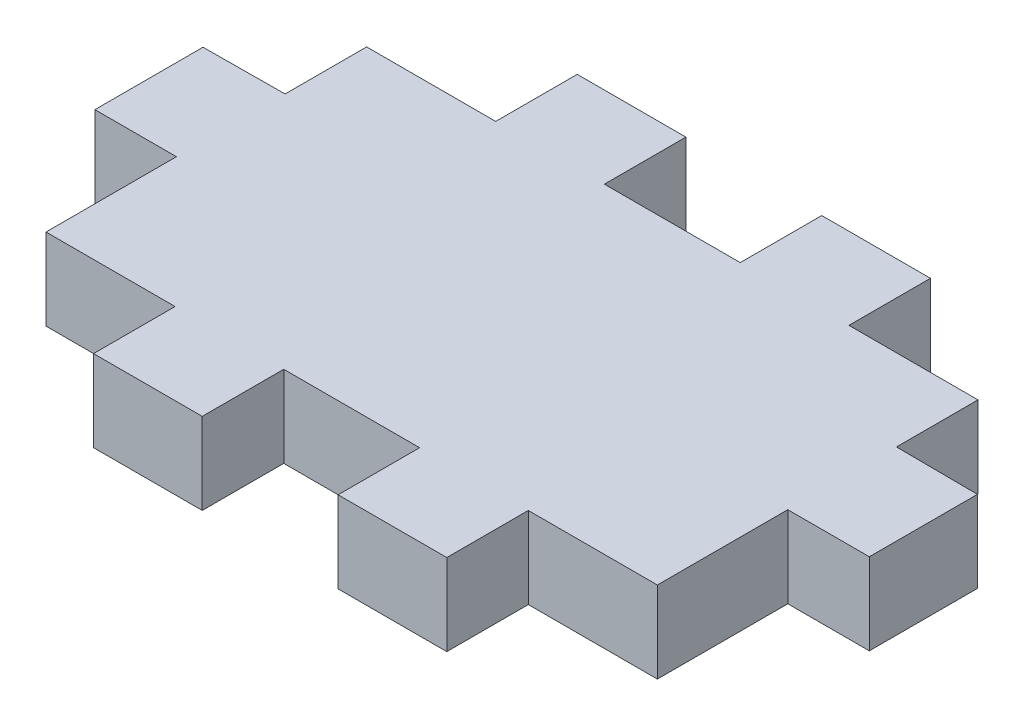
ISO-10303-21;
HEADER;
FILE_DESCRIPTION(('STEP AP214'),'2;1');
FILE_NAME('part.step','',(''),(''),'','','');
FILE_SCHEMA(('AUTOMOTIVE_DESIGN { 1 0 10303 214 1 1 1 1 }'));
ENDSEC;
DATA;
#1=APPLICATION_CONTEXT('core data for automotive mechanical design processes');
#2=APPLICATION_PROTOCOL_DEFINITION('international standard','automotive_design',2000,#1);
#3=PRODUCT_CONTEXT('',#1,'mechanical');
#4=PRODUCT('Part','Part','',(#3));
#5=PRODUCT_RELATED_PRODUCT_CATEGORY('part','',(#4));
#6=PRODUCT_DEFINITION_FORMATION('','',#4);
#7=PRODUCT_DEFINITION_CONTEXT('part definition',#1,'design');
#8=PRODUCT_DEFINITION('design','',#6,#7);
#9=PRODUCT_DEFINITION_SHAPE('','',#8);
#10=(LENGTH_UNIT() NAMED_UNIT(*) SI_UNIT(.MILLI.,.METRE.));
#11=(NAMED_UNIT(*) PLANE_ANGLE_UNIT() SI_UNIT($,.RADIAN.));
#12=(NAMED_UNIT(*) SI_UNIT($,.STERADIAN.) SOLID_ANGLE_UNIT());
#13=UNCERTAINTY_MEASURE_WITH_UNIT(LENGTH_MEASURE(1.E-05),#10,'distance_accuracy_value','');
#14=(GEOMETRIC_REPRESENTATION_CONTEXT(3) GLOBAL_UNCERTAINTY_ASSIGNED_CONTEXT((#13)) GLOBAL_UNIT_ASSIGNED_CONTEXT((#10,
#11,#12)) REPRESENTATION_CONTEXT('',''));
#15=CARTESIAN_POINT('',(0.,0.,0.));
#16=DIRECTION('',(0.,0.,1.));
#17=DIRECTION('',(1.,0.,0.));
#18=AXIS2_PLACEMENT_3D('',#15,#16,#17);
#19=CARTESIAN_POINT('',(-13.5,-7.,-7.2));
#20=DIRECTION('',(0.,0.,-1.));
#21=DIRECTION('',(-1.,0.,0.));
#22=AXIS2_PLACEMENT_3D('',#19,#20,#21);
#23=PLANE('',#22);
#24=DIRECTION('',(-1.,0.,0.));
#25=VECTOR('',#24,1.);
#26=CARTESIAN_POINT('',(-13.5,3.,-7.2));
#27=LINE('',#26,#25);
#28=CARTESIAN_POINT('',(-1.75,3.,-7.2));
#29=VERTEX_POINT('',#28);
#30=CARTESIAN_POINT('',(-5.75,3.,-7.2));
#31=VERTEX_POINT('',#30);
#32=EDGE_CURVE('E343',#29,#31,#27,.T.);
#33=ORIENTED_EDGE('',*,*,#32,.T.);
#34=DIRECTION('',(0.,1.,0.));
#35=VECTOR('',#34,1.);
#36=CARTESIAN_POINT('',(-5.75,-7.,-7.2));
#37=LINE('',#36,#35);
#38=CARTESIAN_POINT('',(-5.75,0.,-7.2));
#39=VERTEX_POINT('',#38);
#40=EDGE_CURVE('E321',#39,#31,#37,.T.);
#41=ORIENTED_EDGE('',*,*,#40,.F.);
#42=DIRECTION('',(1.,0.,0.));
#43=VECTOR('',#42,1.);
#44=CARTESIAN_POINT('',(0.,0.,-7.2));
#45=LINE('',#44,#43);
#46=CARTESIAN_POINT('',(-1.75,0.,-7.2));
#47=VERTEX_POINT('',#46);
#48=EDGE_CURVE('E422',#39,#47,#45,.T.);
#49=ORIENTED_EDGE('',*,*,#48,.T.);
#50=DIRECTION('',(0.,1.,0.));
#51=VECTOR('',#50,1.);
#52=CARTESIAN_POINT('',(-1.75,-7.,-7.2));
#53=LINE('',#52,#51);
#54=EDGE_CURVE('E426',#47,#29,#53,.T.);
#55=ORIENTED_EDGE('',*,*,#54,.T.);
#56=EDGE_LOOP('',(#33,#41,#49,#55));
#57=FACE_BOUND('',#56,.T.);
#58=ADVANCED_FACE('F39',(#57),#23,.F.);
#59=CARTESIAN_POINT('',(15.,3.,-25.));
#60=DIRECTION('',(0.,0.,1.));
#61=DIRECTION('',(1.,0.,0.));
#62=AXIS2_PLACEMENT_3D('',#59,#60,#61);
#63=PLANE('',#62);
#64=DIRECTION('',(-1.,0.,0.));
#65=VECTOR('',#64,1.);
#66=CARTESIAN_POINT('',(15.,3.,-25.));
#67=LINE('',#66,#65);
#68=CARTESIAN_POINT('',(7.24999999999989,3.,-25.));
#69=VERTEX_POINT('',#68);
#70=CARTESIAN_POINT('',(3.2499999999999,3.,-25.));
#71=VERTEX_POINT('',#70);
#72=EDGE_CURVE('E397',#69,#71,#67,.T.);
#73=ORIENTED_EDGE('',*,*,#72,.F.);
#74=DIRECTION('',(0.,1.,0.));
#75=VECTOR('',#74,1.);
#76=CARTESIAN_POINT('',(7.24999999999989,-7.,-25.));
#77=LINE('',#76,#75);
#78=CARTESIAN_POINT('',(7.24999999999989,0.,-25.));
#79=VERTEX_POINT('',#78);
#80=EDGE_CURVE('E361',#79,#69,#77,.T.);
#81=ORIENTED_EDGE('',*,*,#80,.F.);
#82=DIRECTION('',(-1.,0.,0.));
#83=VECTOR('',#82,1.);
#84=CARTESIAN_POINT('',(15.,0.,-25.));
#85=LINE('',#84,#83);
#86=CARTESIAN_POINT('',(3.2499999999999,0.,-25.));
#87=VERTEX_POINT('',#86);
#88=EDGE_CURVE('E394',#79,#87,#85,.T.);
#89=ORIENTED_EDGE('',*,*,#88,.T.);
#90=DIRECTION('',(0.,1.,0.));
#91=VECTOR('',#90,1.);
#92=CARTESIAN_POINT('',(3.2499999999999,-7.,-25.));
#93=LINE('',#92,#91);
#94=EDGE_CURVE('E374',#87,#71,#93,.T.);
#95=ORIENTED_EDGE('',*,*,#94,.T.);
#96=EDGE_LOOP('',(#73,#81,#89,#95));
#97=FACE_BOUND('',#96,.T.);
#98=ADVANCED_FACE('F507',(#97),#63,.F.);
#99=CARTESIAN_POINT('',(-1.75000000000009,3.,-25.));
#100=VERTEX_POINT('',#99);
#101=CARTESIAN_POINT('',(-5.75000000000006,3.,-25.));
#102=VERTEX_POINT('',#101);
#103=EDGE_CURVE('E393',#100,#102,#67,.T.);
#104=ORIENTED_EDGE('',*,*,#103,.F.);
#105=DIRECTION('',(0.,1.,0.));
#106=VECTOR('',#105,1.);
#107=CARTESIAN_POINT('',(-1.75000000000009,-7.,-25.));
#108=LINE('',#107,#106);
#109=CARTESIAN_POINT('',(-1.75000000000009,0.,-25.));
#110=VERTEX_POINT('',#109);
#111=EDGE_CURVE('E378',#110,#100,#108,.T.);
#112=ORIENTED_EDGE('',*,*,#111,.F.);
#113=CARTESIAN_POINT('',(-5.75000000000006,0.,-25.));
#114=VERTEX_POINT('',#113);
#115=EDGE_CURVE('E400',#110,#114,#85,.T.);
#116=ORIENTED_EDGE('',*,*,#115,.T.);
#117=DIRECTION('',(0.,1.,0.));
#118=VECTOR('',#117,1.);
#119=CARTESIAN_POINT('',(-5.75000000000006,-7.,-25.));
#120=LINE('',#119,#118);
#121=EDGE_CURVE('E385',#114,#102,#120,.T.);
#122=ORIENTED_EDGE('',*,*,#121,.T.);
#123=EDGE_LOOP('',(#104,#112,#116,#122));
#124=FACE_BOUND('',#123,.T.);
#125=ADVANCED_FACE('F488',(#124),#63,.F.);
#126=CARTESIAN_POINT('',(15.,3.,-25.));
#127=DIRECTION('',(-1.,0.,0.));
#128=DIRECTION('',(0.,0.,1.));
#129=AXIS2_PLACEMENT_3D('',#126,#127,#128);
#130=PLANE('',#129);
#131=DIRECTION('',(0.,0.,-1.));
#132=VECTOR('',#131,1.);
#133=CARTESIAN_POINT('',(15.,3.,-25.));
#134=LINE('',#133,#132);
#135=CARTESIAN_POINT('',(14.9999999999999,3.,-15.0000000000002));
#136=VERTEX_POINT('',#135);
#137=CARTESIAN_POINT('',(14.9999999999999,3.,-18.9776324514102));
#138=VERTEX_POINT('',#137);
#139=EDGE_CURVE('E390',#136,#138,#134,.T.);
#140=ORIENTED_EDGE('',*,*,#139,.F.);
#141=DIRECTION('',(0.,1.,0.));
#142=VECTOR('',#141,1.);
#143=CARTESIAN_POINT('',(14.9999999999999,0.,-15.0000000000002));
#144=LINE('',#143,#142);
#145=CARTESIAN_POINT('',(14.9999999999999,0.,-15.0000000000002));
#146=VERTEX_POINT('',#145);
#147=EDGE_CURVE('E298',#146,#136,#144,.T.);
#148=ORIENTED_EDGE('',*,*,#147,.F.);
#149=DIRECTION('',(0.,0.,-1.));
#150=VECTOR('',#149,1.);
#151=CARTESIAN_POINT('',(15.,0.,-25.));
#152=LINE('',#151,#150);
#153=CARTESIAN_POINT('',(14.9999999999999,0.,-18.9776324514102));
#154=VERTEX_POINT('',#153);
#155=EDGE_CURVE('E363',#146,#154,#152,.T.);
#156=ORIENTED_EDGE('',*,*,#155,.T.);
#157=DIRECTION('',(0.,1.,0.));
#158=VECTOR('',#157,1.);
#159=CARTESIAN_POINT('',(14.9999999999999,0.,-18.9776324514102));
#160=LINE('',#159,#158);
#161=EDGE_CURVE('E300',#154,#138,#160,.T.);
#162=ORIENTED_EDGE('',*,*,#161,.T.);
#163=EDGE_LOOP('',(#140,#148,#156,#162));
#164=FACE_BOUND('',#163,.T.);
#165=ADVANCED_FACE('F41',(#164),#130,.F.);
#166=CARTESIAN_POINT('',(0.,3.,0.));
#167=DIRECTION('',(0.,-1.,0.));
#168=DIRECTION('',(0.,0.,-1.));
#169=AXIS2_PLACEMENT_3D('',#166,#167,#168);
#170=PLANE('',#169);
#171=DIRECTION('',(1.,0.,0.));
#172=VECTOR('',#171,1.);
#173=CARTESIAN_POINT('',(-5.75000000000006,3.,-22.));
#174=LINE('',#173,#172);
#175=CARTESIAN_POINT('',(-10.5,3.,-22.));
#176=VERTEX_POINT('',#175);
#177=CARTESIAN_POINT('',(-5.75000000000006,3.,-22.));
#178=VERTEX_POINT('',#177);
#179=EDGE_CURVE('E383',#176,#178,#174,.T.);
#180=ORIENTED_EDGE('',*,*,#179,.F.);
#181=DIRECTION('',(0.,0.,-1.));
#182=VECTOR('',#181,1.);
#183=CARTESIAN_POINT('',(-10.5,3.,-19.));
#184=LINE('',#183,#182);
#185=CARTESIAN_POINT('',(-10.5,3.,-19.));
#186=VERTEX_POINT('',#185);
#187=EDGE_CURVE('E249',#186,#176,#184,.T.);
#188=ORIENTED_EDGE('',*,*,#187,.F.);
#189=DIRECTION('',(0.999972206312669,0.,-0.00745564230447437));
#190=VECTOR('',#189,1.);
#191=CARTESIAN_POINT('',(-13.5,3.,-18.9776324514099));
#192=LINE('',#191,#190);
#193=CARTESIAN_POINT('',(-13.5,3.,-18.9776324514099));
#194=VERTEX_POINT('',#193);
#195=EDGE_CURVE('E251',#194,#186,#192,.T.);
#196=ORIENTED_EDGE('',*,*,#195,.F.);
#197=DIRECTION('',(0.,0.,-1.));
#198=VECTOR('',#197,1.);
#199=CARTESIAN_POINT('',(-13.5,3.,-22.));
#200=LINE('',#199,#198);
#201=CARTESIAN_POINT('',(-13.5,3.,-15.));
#202=VERTEX_POINT('',#201);
#203=EDGE_CURVE('E347',#202,#194,#200,.T.);
#204=ORIENTED_EDGE('',*,*,#203,.F.);
#205=DIRECTION('',(-1.,0.,0.));
#206=VECTOR('',#205,1.);
#207=CARTESIAN_POINT('',(-10.5,3.,-15.));
#208=LINE('',#207,#206);
#209=CARTESIAN_POINT('',(-10.5,3.,-15.));
#210=VERTEX_POINT('',#209);
#211=EDGE_CURVE('E258',#210,#202,#208,.T.);
#212=ORIENTED_EDGE('',*,*,#211,.F.);
#213=DIRECTION('',(0.,0.,-1.));
#214=VECTOR('',#213,1.);
#215=CARTESIAN_POINT('',(-10.5,3.,-10.2));
#216=LINE('',#215,#214);
#217=CARTESIAN_POINT('',(-10.5,3.,-10.2));
#218=VERTEX_POINT('',#217);
#219=EDGE_CURVE('E230',#218,#210,#216,.T.);
#220=ORIENTED_EDGE('',*,*,#219,.F.);
#221=DIRECTION('',(-1.,0.,0.));
#222=VECTOR('',#221,1.);
#223=CARTESIAN_POINT('',(-13.5,3.,-10.2));
#224=LINE('',#223,#222);
#225=CARTESIAN_POINT('',(-5.75,3.,-10.2));
#226=VERTEX_POINT('',#225);
#227=EDGE_CURVE('E317',#226,#218,#224,.T.);
#228=ORIENTED_EDGE('',*,*,#227,.F.);
#229=DIRECTION('',(0.,0.,-1.));
#230=VECTOR('',#229,1.);
#231=CARTESIAN_POINT('',(-5.75,3.,-10.2));
#232=LINE('',#231,#230);
#233=EDGE_CURVE('E314',#31,#226,#232,.T.);
#234=ORIENTED_EDGE('',*,*,#233,.F.);
#235=ORIENTED_EDGE('',*,*,#32,.F.);
#236=DIRECTION('',(0.,0.,1.));
#237=VECTOR('',#236,1.);
#238=CARTESIAN_POINT('',(-1.75,3.,-10.2));
#239=LINE('',#238,#237);
#240=CARTESIAN_POINT('',(-1.75,3.,-10.2));
#241=VERTEX_POINT('',#240);
#242=EDGE_CURVE('E266',#241,#29,#239,.T.);
#243=ORIENTED_EDGE('',*,*,#242,.F.);
#244=DIRECTION('',(-1.,0.,0.));
#245=VECTOR('',#244,1.);
#246=CARTESIAN_POINT('',(-1.75,3.,-10.2));
#247=LINE('',#246,#245);
#248=CARTESIAN_POINT('',(3.25,3.,-10.2));
#249=VERTEX_POINT('',#248);
#250=EDGE_CURVE('E328',#249,#241,#247,.T.);
#251=ORIENTED_EDGE('',*,*,#250,.F.);
#252=DIRECTION('',(0.,0.,-1.));
#253=VECTOR('',#252,1.);
#254=CARTESIAN_POINT('',(3.25,3.,-10.2));
#255=LINE('',#254,#253);
#256=CARTESIAN_POINT('',(3.25,3.,-7.2));
#257=VERTEX_POINT('',#256);
#258=EDGE_CURVE('E325',#257,#249,#255,.T.);
#259=ORIENTED_EDGE('',*,*,#258,.F.);
#260=CARTESIAN_POINT('',(7.25,3.,-7.2));
#261=VERTEX_POINT('',#260);
#262=EDGE_CURVE('E346',#261,#257,#27,.T.);
#263=ORIENTED_EDGE('',*,*,#262,.F.);
#264=DIRECTION('',(0.,0.,1.));
#265=VECTOR('',#264,1.);
#266=CARTESIAN_POINT('',(7.25,3.,-7.2));
#267=LINE('',#266,#265);
#268=CARTESIAN_POINT('',(7.25,3.,-10.2));
#269=VERTEX_POINT('',#268);
#270=EDGE_CURVE('E306',#269,#261,#267,.T.);
#271=ORIENTED_EDGE('',*,*,#270,.F.);
#272=DIRECTION('',(-1.,0.,0.));
#273=VECTOR('',#272,1.);
#274=CARTESIAN_POINT('',(7.25,3.,-10.2));
#275=LINE('',#274,#273);
#276=CARTESIAN_POINT('',(11.9999999999998,3.,-10.2));
#277=VERTEX_POINT('',#276);
#278=EDGE_CURVE('E308',#277,#269,#275,.T.);
#279=ORIENTED_EDGE('',*,*,#278,.F.);
#280=DIRECTION('',(0.,0.,1.));
#281=VECTOR('',#280,1.);
#282=CARTESIAN_POINT('',(12.,3.,-10.2000000000002));
#283=LINE('',#282,#281);
#284=CARTESIAN_POINT('',(11.9999999999999,3.,-15.0000000000002));
#285=VERTEX_POINT('',#284);
#286=EDGE_CURVE('E275',#285,#277,#283,.T.);
#287=ORIENTED_EDGE('',*,*,#286,.F.);
#288=DIRECTION('',(-1.,0.,0.));
#289=VECTOR('',#288,1.);
#290=CARTESIAN_POINT('',(11.9999999999999,3.,-15.0000000000002));
#291=LINE('',#290,#289);
#292=EDGE_CURVE('E290',#136,#285,#291,.T.);
#293=ORIENTED_EDGE('',*,*,#292,.F.);
#294=ORIENTED_EDGE('',*,*,#139,.T.);
#295=DIRECTION('',(0.99997220631267,0.,0.00745564230445818));
#296=VECTOR('',#295,1.);
#297=CARTESIAN_POINT('',(14.9999999999999,3.,-18.9776324514102));
#298=LINE('',#297,#296);
#299=CARTESIAN_POINT('',(11.9999999999999,3.,-19.0000000000002));
#300=VERTEX_POINT('',#299);
#301=EDGE_CURVE('E288',#300,#138,#298,.T.);
#302=ORIENTED_EDGE('',*,*,#301,.F.);
#303=DIRECTION('',(0.,0.,1.));
#304=VECTOR('',#303,1.);
#305=CARTESIAN_POINT('',(11.9999999999999,3.,-19.0000000000002));
#306=LINE('',#305,#304);
#307=CARTESIAN_POINT('',(11.9999999999998,3.,-22.0000000000002));
#308=VERTEX_POINT('',#307);
#309=EDGE_CURVE('E285',#308,#300,#306,.T.);
#310=ORIENTED_EDGE('',*,*,#309,.F.);
#311=DIRECTION('',(1.,0.,0.));
#312=VECTOR('',#311,1.);
#313=CARTESIAN_POINT('',(7.24999999999989,3.,-22.));
#314=LINE('',#313,#312);
#315=CARTESIAN_POINT('',(7.24999999999989,3.,-22.));
#316=VERTEX_POINT('',#315);
#317=EDGE_CURVE('E356',#316,#308,#314,.T.);
#318=ORIENTED_EDGE('',*,*,#317,.F.);
#319=DIRECTION('',(0.,0.,1.));
#320=VECTOR('',#319,1.);
#321=CARTESIAN_POINT('',(7.24999999999989,3.,-22.));
#322=LINE('',#321,#320);
#323=EDGE_CURVE('E353',#69,#316,#322,.T.);
#324=ORIENTED_EDGE('',*,*,#323,.F.);
#325=ORIENTED_EDGE('',*,*,#72,.T.);
#326=DIRECTION('',(0.,0.,-1.));
#327=VECTOR('',#326,1.);
#328=CARTESIAN_POINT('',(3.2499999999999,3.,-22.));
#329=LINE('',#328,#327);
#330=CARTESIAN_POINT('',(3.2499999999999,3.,-22.));
#331=VERTEX_POINT('',#330);
#332=EDGE_CURVE('E365',#331,#71,#329,.T.);
#333=ORIENTED_EDGE('',*,*,#332,.F.);
#334=DIRECTION('',(1.,0.,0.));
#335=VECTOR('',#334,1.);
#336=CARTESIAN_POINT('',(3.2499999999999,3.,-22.));
#337=LINE('',#336,#335);
#338=CARTESIAN_POINT('',(-1.75000000000009,3.,-22.));
#339=VERTEX_POINT('',#338);
#340=EDGE_CURVE('E371',#339,#331,#337,.T.);
#341=ORIENTED_EDGE('',*,*,#340,.F.);
#342=DIRECTION('',(0.,0.,1.));
#343=VECTOR('',#342,1.);
#344=CARTESIAN_POINT('',(-1.75000000000009,3.,-22.));
#345=LINE('',#344,#343);
#346=EDGE_CURVE('E367',#100,#339,#345,.T.);
#347=ORIENTED_EDGE('',*,*,#346,.F.);
#348=ORIENTED_EDGE('',*,*,#103,.T.);
#349=DIRECTION('',(0.,0.,-1.));
#350=VECTOR('',#349,1.);
#351=CARTESIAN_POINT('',(-5.75000000000006,3.,-22.));
#352=LINE('',#351,#350);
#353=EDGE_CURVE('E352',#178,#102,#352,.T.);
#354=ORIENTED_EDGE('',*,*,#353,.F.);
#355=EDGE_LOOP('',(#180,#188,#196,#204,#212,#220,#228,#234,#235,#243,#251,#259,#263,#271,#279,
#287,#293,#294,#302,#310,#318,#324,#325,#333,#341,#347,#348,#354));
#356=FACE_BOUND('',#355,.T.);
#357=ADVANCED_FACE('F451',(#356),#170,.F.);
#358=CARTESIAN_POINT('',(0.,0.,0.));
#359=DIRECTION('',(0.,-1.,0.));
#360=DIRECTION('',(0.,0.,-1.));
#361=AXIS2_PLACEMENT_3D('',#358,#359,#360);
#362=PLANE('',#361);
#363=DIRECTION('',(0.,0.,-1.));
#364=VECTOR('',#363,1.);
#365=CARTESIAN_POINT('',(-10.5,0.,-19.));
#366=LINE('',#365,#364);
#367=CARTESIAN_POINT('',(-10.5,0.,-19.));
#368=VERTEX_POINT('',#367);
#369=CARTESIAN_POINT('',(-10.5,0.,-22.));
#370=VERTEX_POINT('',#369);
#371=EDGE_CURVE('E255',#368,#370,#366,.T.);
#372=ORIENTED_EDGE('',*,*,#371,.T.);
#373=DIRECTION('',(-1.,0.,0.));
#374=VECTOR('',#373,1.);
#375=CARTESIAN_POINT('',(0.,0.,-22.));
#376=LINE('',#375,#374);
#377=CARTESIAN_POINT('',(-5.75000000000006,0.,-22.));
#378=VERTEX_POINT('',#377);
#379=EDGE_CURVE('E403',#378,#370,#376,.T.);
#380=ORIENTED_EDGE('',*,*,#379,.F.);
#381=DIRECTION('',(0.,0.,1.));
#382=VECTOR('',#381,1.);
#383=CARTESIAN_POINT('',(-5.75000000000006,0.,0.));
#384=LINE('',#383,#382);
#385=EDGE_CURVE('E406',#114,#378,#384,.T.);
#386=ORIENTED_EDGE('',*,*,#385,.F.);
#387=ORIENTED_EDGE('',*,*,#115,.F.);
#388=DIRECTION('',(0.,0.,-1.));
#389=VECTOR('',#388,1.);
#390=CARTESIAN_POINT('',(-1.75000000000009,0.,0.));
#391=LINE('',#390,#389);
#392=CARTESIAN_POINT('',(-1.75000000000009,0.,-22.));
#393=VERTEX_POINT('',#392);
#394=EDGE_CURVE('E408',#393,#110,#391,.T.);
#395=ORIENTED_EDGE('',*,*,#394,.F.);
#396=DIRECTION('',(-1.,0.,0.));
#397=VECTOR('',#396,1.);
#398=CARTESIAN_POINT('',(0.,0.,-22.));
#399=LINE('',#398,#397);
#400=CARTESIAN_POINT('',(3.2499999999999,0.,-22.));
#401=VERTEX_POINT('',#400);
#402=EDGE_CURVE('E410',#401,#393,#399,.T.);
#403=ORIENTED_EDGE('',*,*,#402,.F.);
#404=DIRECTION('',(0.,0.,1.));
#405=VECTOR('',#404,1.);
#406=CARTESIAN_POINT('',(3.2499999999999,0.,0.));
#407=LINE('',#406,#405);
#408=EDGE_CURVE('E413',#87,#401,#407,.T.);
#409=ORIENTED_EDGE('',*,*,#408,.F.);
#410=ORIENTED_EDGE('',*,*,#88,.F.);
#411=DIRECTION('',(0.,0.,-1.));
#412=VECTOR('',#411,1.);
#413=CARTESIAN_POINT('',(7.24999999999989,0.,0.));
#414=LINE('',#413,#412);
#415=CARTESIAN_POINT('',(7.24999999999989,0.,-22.));
#416=VERTEX_POINT('',#415);
#417=EDGE_CURVE('E417',#416,#79,#414,.T.);
#418=ORIENTED_EDGE('',*,*,#417,.F.);
#419=DIRECTION('',(-1.,0.,0.));
#420=VECTOR('',#419,1.);
#421=CARTESIAN_POINT('',(0.,0.,-22.));
#422=LINE('',#421,#420);
#423=CARTESIAN_POINT('',(11.9999999999998,0.,-22.));
#424=VERTEX_POINT('',#423);
#425=EDGE_CURVE('E415',#424,#416,#422,.T.);
#426=ORIENTED_EDGE('',*,*,#425,.F.);
#427=DIRECTION('',(0.,0.,1.));
#428=VECTOR('',#427,1.);
#429=CARTESIAN_POINT('',(11.9999999999999,0.,-19.0000000000002));
#430=LINE('',#429,#428);
#431=CARTESIAN_POINT('',(11.9999999999999,0.,-19.0000000000002));
#432=VERTEX_POINT('',#431);
#433=EDGE_CURVE('E54',#424,#432,#430,.T.);
#434=ORIENTED_EDGE('',*,*,#433,.T.);
#435=DIRECTION('',(0.99997220631267,0.,0.00745564230445818));
#436=VECTOR('',#435,1.);
#437=CARTESIAN_POINT('',(14.9999999999999,0.,-18.9776324514102));
#438=LINE('',#437,#436);
#439=EDGE_CURVE('E274',#432,#154,#438,.T.);
#440=ORIENTED_EDGE('',*,*,#439,.T.);
#441=ORIENTED_EDGE('',*,*,#155,.F.);
#442=DIRECTION('',(-1.,0.,0.));
#443=VECTOR('',#442,1.);
#444=CARTESIAN_POINT('',(11.9999999999999,0.,-15.0000000000002));
#445=LINE('',#444,#443);
#446=CARTESIAN_POINT('',(11.9999999999999,0.,-15.0000000000002));
#447=VERTEX_POINT('',#446);
#448=EDGE_CURVE('E278',#146,#447,#445,.T.);
#449=ORIENTED_EDGE('',*,*,#448,.T.);
#450=DIRECTION('',(0.,0.,1.));
#451=VECTOR('',#450,1.);
#452=CARTESIAN_POINT('',(12.,0.,-10.2000000000002));
#453=LINE('',#452,#451);
#454=CARTESIAN_POINT('',(12.,0.,-10.2000000000002));
#455=VERTEX_POINT('',#454);
#456=EDGE_CURVE('E281',#447,#455,#453,.T.);
#457=ORIENTED_EDGE('',*,*,#456,.T.);
#458=DIRECTION('',(1.,0.,0.));
#459=VECTOR('',#458,1.);
#460=CARTESIAN_POINT('',(0.,0.,-10.2));
#461=LINE('',#460,#459);
#462=CARTESIAN_POINT('',(7.25,0.,-10.2));
#463=VERTEX_POINT('',#462);
#464=EDGE_CURVE('E11',#463,#455,#461,.T.);
#465=ORIENTED_EDGE('',*,*,#464,.F.);
#466=DIRECTION('',(0.,0.,-1.));
#467=VECTOR('',#466,1.);
#468=CARTESIAN_POINT('',(7.25,0.,0.));
#469=LINE('',#468,#467);
#470=CARTESIAN_POINT('',(7.25,0.,-7.2));
#471=VERTEX_POINT('',#470);
#472=EDGE_CURVE('E341',#471,#463,#469,.T.);
#473=ORIENTED_EDGE('',*,*,#472,.F.);
#474=CARTESIAN_POINT('',(3.25,0.,-7.2));
#475=VERTEX_POINT('',#474);
#476=EDGE_CURVE('E419',#475,#471,#45,.T.);
#477=ORIENTED_EDGE('',*,*,#476,.F.);
#478=DIRECTION('',(0.,0.,1.));
#479=VECTOR('',#478,1.);
#480=CARTESIAN_POINT('',(3.25,0.,0.));
#481=LINE('',#480,#479);
#482=CARTESIAN_POINT('',(3.25,0.,-10.2));
#483=VERTEX_POINT('',#482);
#484=EDGE_CURVE('E335',#483,#475,#481,.T.);
#485=ORIENTED_EDGE('',*,*,#484,.F.);
#486=DIRECTION('',(1.,0.,0.));
#487=VECTOR('',#486,1.);
#488=CARTESIAN_POINT('',(0.,0.,-10.2));
#489=LINE('',#488,#487);
#490=CARTESIAN_POINT('',(-1.75,0.,-10.2));
#491=VERTEX_POINT('',#490);
#492=EDGE_CURVE('E47',#491,#483,#489,.T.);
#493=ORIENTED_EDGE('',*,*,#492,.F.);
#494=DIRECTION('',(0.,0.,-1.));
#495=VECTOR('',#494,1.);
#496=CARTESIAN_POINT('',(-1.75,0.,0.));
#497=LINE('',#496,#495);
#498=EDGE_CURVE('E337',#47,#491,#497,.T.);
#499=ORIENTED_EDGE('',*,*,#498,.F.);
#500=ORIENTED_EDGE('',*,*,#48,.F.);
#501=DIRECTION('',(0.,0.,1.));
#502=VECTOR('',#501,1.);
#503=CARTESIAN_POINT('',(-5.75,0.,0.));
#504=LINE('',#503,#502);
#505=CARTESIAN_POINT('',(-5.75,0.,-10.2));
#506=VERTEX_POINT('',#505);
#507=EDGE_CURVE('E339',#506,#39,#504,.T.);
#508=ORIENTED_EDGE('',*,*,#507,.F.);
#509=DIRECTION('',(1.,0.,0.));
#510=VECTOR('',#509,1.);
#511=CARTESIAN_POINT('',(0.,0.,-10.2));
#512=LINE('',#511,#510);
#513=CARTESIAN_POINT('',(-10.5,0.,-10.2));
#514=VERTEX_POINT('',#513);
#515=EDGE_CURVE('E248',#514,#506,#512,.T.);
#516=ORIENTED_EDGE('',*,*,#515,.F.);
#517=DIRECTION('',(0.,0.,-1.));
#518=VECTOR('',#517,1.);
#519=CARTESIAN_POINT('',(-10.5,0.,-10.2));
#520=LINE('',#519,#518);
#521=CARTESIAN_POINT('',(-10.5,0.,-15.));
#522=VERTEX_POINT('',#521);
#523=EDGE_CURVE('E227',#514,#522,#520,.T.);
#524=ORIENTED_EDGE('',*,*,#523,.T.);
#525=DIRECTION('',(-1.,0.,0.));
#526=VECTOR('',#525,1.);
#527=CARTESIAN_POINT('',(-10.5,0.,-15.));
#528=LINE('',#527,#526);
#529=CARTESIAN_POINT('',(-13.5,0.,-15.));
#530=VERTEX_POINT('',#529);
#531=EDGE_CURVE('E237',#522,#530,#528,.T.);
#532=ORIENTED_EDGE('',*,*,#531,.T.);
#533=DIRECTION('',(0.,0.,1.));
#534=VECTOR('',#533,1.);
#535=CARTESIAN_POINT('',(-13.5,0.,0.));
#536=LINE('',#535,#534);
#537=CARTESIAN_POINT('',(-13.5,0.,-18.9776324514099));
#538=VERTEX_POINT('',#537);
#539=EDGE_CURVE('E350',#538,#530,#536,.T.);
#540=ORIENTED_EDGE('',*,*,#539,.F.);
#541=DIRECTION('',(0.999972206312669,0.,-0.00745564230447437));
#542=VECTOR('',#541,1.);
#543=CARTESIAN_POINT('',(-13.5,0.,-18.9776324514099));
#544=LINE('',#543,#542);
#545=EDGE_CURVE('E62',#538,#368,#544,.T.);
#546=ORIENTED_EDGE('',*,*,#545,.T.);
#547=EDGE_LOOP('',(#372,#380,#386,#387,#395,#403,#409,#410,#418,#426,#434,#440,#441,#449,#457,
#465,#473,#477,#485,#493,#499,#500,#508,#516,#524,#532,#540,#546));
#548=FACE_BOUND('',#547,.T.);
#549=ADVANCED_FACE('F246',(#548),#362,.T.);
#550=CARTESIAN_POINT('',(-5.75000000000006,-7.,-22.));
#551=DIRECTION('',(1.,0.,0.));
#552=DIRECTION('',(0.,0.,-1.));
#553=AXIS2_PLACEMENT_3D('',#550,#551,#552);
#554=PLANE('',#553);
#555=ORIENTED_EDGE('',*,*,#385,.T.);
#556=DIRECTION('',(0.,1.,0.));
#557=VECTOR('',#556,1.);
#558=CARTESIAN_POINT('',(-5.75000000000006,-7.,-22.));
#559=LINE('',#558,#557);
#560=EDGE_CURVE('E368',#378,#178,#559,.T.);
#561=ORIENTED_EDGE('',*,*,#560,.T.);
#562=ORIENTED_EDGE('',*,*,#353,.T.);
#563=ORIENTED_EDGE('',*,*,#121,.F.);
#564=EDGE_LOOP('',(#555,#561,#562,#563));
#565=FACE_BOUND('',#564,.T.);
#566=ADVANCED_FACE('F481',(#565),#554,.F.);
#567=CARTESIAN_POINT('',(-5.75000000000006,-7.,-22.));
#568=DIRECTION('',(0.,0.,1.));
#569=DIRECTION('',(1.,0.,0.));
#570=AXIS2_PLACEMENT_3D('',#567,#568,#569);
#571=PLANE('',#570);
#572=ORIENTED_EDGE('',*,*,#379,.T.);
#573=DIRECTION('',(0.,1.,0.));
#574=VECTOR('',#573,1.);
#575=CARTESIAN_POINT('',(-10.5,0.,-22.));
#576=LINE('',#575,#574);
#577=EDGE_CURVE('E263',#370,#176,#576,.T.);
#578=ORIENTED_EDGE('',*,*,#577,.T.);
#579=ORIENTED_EDGE('',*,*,#179,.T.);
#580=ORIENTED_EDGE('',*,*,#560,.F.);
#581=EDGE_LOOP('',(#572,#578,#579,#580));
#582=FACE_BOUND('',#581,.T.);
#583=ADVANCED_FACE('F478',(#582),#571,.F.);
#584=CARTESIAN_POINT('',(3.2499999999999,-7.,-22.));
#585=DIRECTION('',(1.,0.,0.));
#586=DIRECTION('',(0.,0.,-1.));
#587=AXIS2_PLACEMENT_3D('',#584,#585,#586);
#588=PLANE('',#587);
#589=ORIENTED_EDGE('',*,*,#408,.T.);
#590=DIRECTION('',(0.,1.,0.));
#591=VECTOR('',#590,1.);
#592=CARTESIAN_POINT('',(3.2499999999999,-7.,-22.));
#593=LINE('',#592,#591);
#594=EDGE_CURVE('E357',#401,#331,#593,.T.);
#595=ORIENTED_EDGE('',*,*,#594,.T.);
#596=ORIENTED_EDGE('',*,*,#332,.T.);
#597=ORIENTED_EDGE('',*,*,#94,.F.);
#598=EDGE_LOOP('',(#589,#595,#596,#597));
#599=FACE_BOUND('',#598,.T.);
#600=ADVANCED_FACE('F500',(#599),#588,.F.);
#601=CARTESIAN_POINT('',(3.2499999999999,-7.,-22.));
#602=DIRECTION('',(0.,0.,1.));
#603=DIRECTION('',(1.,0.,0.));
#604=AXIS2_PLACEMENT_3D('',#601,#602,#603);
#605=PLANE('',#604);
#606=ORIENTED_EDGE('',*,*,#402,.T.);
#607=DIRECTION('',(0.,1.,0.));
#608=VECTOR('',#607,1.);
#609=CARTESIAN_POINT('',(-1.75000000000009,-7.,-22.));
#610=LINE('',#609,#608);
#611=EDGE_CURVE('E376',#393,#339,#610,.T.);
#612=ORIENTED_EDGE('',*,*,#611,.T.);
#613=ORIENTED_EDGE('',*,*,#340,.T.);
#614=ORIENTED_EDGE('',*,*,#594,.F.);
#615=EDGE_LOOP('',(#606,#612,#613,#614));
#616=FACE_BOUND('',#615,.T.);
#617=ADVANCED_FACE('F497',(#616),#605,.F.);
#618=CARTESIAN_POINT('',(-1.75000000000009,-7.,-22.));
#619=DIRECTION('',(-1.,0.,0.));
#620=DIRECTION('',(0.,0.,1.));
#621=AXIS2_PLACEMENT_3D('',#618,#619,#620);
#622=PLANE('',#621);
#623=ORIENTED_EDGE('',*,*,#394,.T.);
#624=ORIENTED_EDGE('',*,*,#111,.T.);
#625=ORIENTED_EDGE('',*,*,#346,.T.);
#626=ORIENTED_EDGE('',*,*,#611,.F.);
#627=EDGE_LOOP('',(#623,#624,#625,#626));
#628=FACE_BOUND('',#627,.T.);
#629=ADVANCED_FACE('F494',(#628),#622,.F.);
#630=CARTESIAN_POINT('',(7.24999999999989,-7.,-22.));
#631=DIRECTION('',(-1.,0.,0.));
#632=DIRECTION('',(0.,0.,1.));
#633=AXIS2_PLACEMENT_3D('',#630,#631,#632);
#634=PLANE('',#633);
#635=ORIENTED_EDGE('',*,*,#417,.T.);
#636=ORIENTED_EDGE('',*,*,#80,.T.);
#637=ORIENTED_EDGE('',*,*,#323,.T.);
#638=DIRECTION('',(0.,1.,0.));
#639=VECTOR('',#638,1.);
#640=CARTESIAN_POINT('',(7.24999999999989,-7.,-22.));
#641=LINE('',#640,#639);
#642=EDGE_CURVE('E360',#416,#316,#641,.T.);
#643=ORIENTED_EDGE('',*,*,#642,.F.);
#644=EDGE_LOOP('',(#635,#636,#637,#643));
#645=FACE_BOUND('',#644,.T.);
#646=ADVANCED_FACE('F511',(#645),#634,.F.);
#647=CARTESIAN_POINT('',(7.24999999999989,-7.,-22.));
#648=DIRECTION('',(0.,0.,1.));
#649=DIRECTION('',(1.,0.,0.));
#650=AXIS2_PLACEMENT_3D('',#647,#648,#649);
#651=PLANE('',#650);
#652=ORIENTED_EDGE('',*,*,#317,.T.);
#653=DIRECTION('',(0.,1.,0.));
#654=VECTOR('',#653,1.);
#655=CARTESIAN_POINT('',(11.9999999999998,0.,-22.0000000000002));
#656=LINE('',#655,#654);
#657=EDGE_CURVE('E284',#424,#308,#656,.T.);
#658=ORIENTED_EDGE('',*,*,#657,.F.);
#659=ORIENTED_EDGE('',*,*,#425,.T.);
#660=ORIENTED_EDGE('',*,*,#642,.T.);
#661=EDGE_LOOP('',(#652,#658,#659,#660));
#662=FACE_BOUND('',#661,.T.);
#663=ADVANCED_FACE('F517',(#662),#651,.F.);
#664=ORIENTED_EDGE('',*,*,#476,.T.);
#665=DIRECTION('',(0.,1.,0.));
#666=VECTOR('',#665,1.);
#667=CARTESIAN_POINT('',(7.25,-7.,-7.2));
#668=LINE('',#667,#666);
#669=EDGE_CURVE('E429',#471,#261,#668,.T.);
#670=ORIENTED_EDGE('',*,*,#669,.T.);
#671=ORIENTED_EDGE('',*,*,#262,.T.);
#672=DIRECTION('',(0.,-1.,0.));
#673=VECTOR('',#672,1.);
#674=CARTESIAN_POINT('',(3.25,-7.,-7.2));
#675=LINE('',#674,#673);
#676=EDGE_CURVE('E423',#257,#475,#675,.T.);
#677=ORIENTED_EDGE('',*,*,#676,.T.);
#678=EDGE_LOOP('',(#664,#670,#671,#677));
#679=FACE_BOUND('',#678,.T.);
#680=ADVANCED_FACE('F446',(#679),#23,.F.);
#681=CARTESIAN_POINT('',(-13.5,-7.,-22.));
#682=DIRECTION('',(1.,0.,0.));
#683=DIRECTION('',(0.,0.,-1.));
#684=AXIS2_PLACEMENT_3D('',#681,#682,#683);
#685=PLANE('',#684);
#686=ORIENTED_EDGE('',*,*,#203,.T.);
#687=DIRECTION('',(0.,1.,0.));
#688=VECTOR('',#687,1.);
#689=CARTESIAN_POINT('',(-13.5,0.,-18.9776324514099));
#690=LINE('',#689,#688);
#691=EDGE_CURVE('E269',#538,#194,#690,.T.);
#692=ORIENTED_EDGE('',*,*,#691,.F.);
#693=ORIENTED_EDGE('',*,*,#539,.T.);
#694=DIRECTION('',(0.,1.,0.));
#695=VECTOR('',#694,1.);
#696=CARTESIAN_POINT('',(-13.5,0.,-15.));
#697=LINE('',#696,#695);
#698=EDGE_CURVE('E233',#530,#202,#697,.T.);
#699=ORIENTED_EDGE('',*,*,#698,.T.);
#700=EDGE_LOOP('',(#686,#692,#693,#699));
#701=FACE_BOUND('',#700,.T.);
#702=ADVANCED_FACE('F471',(#701),#685,.F.);
#703=CARTESIAN_POINT('',(-13.5,-7.,-10.2));
#704=DIRECTION('',(0.,0.,-1.));
#705=DIRECTION('',(-1.,0.,0.));
#706=AXIS2_PLACEMENT_3D('',#703,#704,#705);
#707=PLANE('',#706);
#708=ORIENTED_EDGE('',*,*,#227,.T.);
#709=DIRECTION('',(0.,1.,0.));
#710=VECTOR('',#709,1.);
#711=CARTESIAN_POINT('',(-10.5,0.,-10.2));
#712=LINE('',#711,#710);
#713=EDGE_CURVE('E234',#514,#218,#712,.T.);
#714=ORIENTED_EDGE('',*,*,#713,.F.);
#715=ORIENTED_EDGE('',*,*,#515,.T.);
#716=DIRECTION('',(0.,1.,0.));
#717=VECTOR('',#716,1.);
#718=CARTESIAN_POINT('',(-5.75,-7.,-10.2));
#719=LINE('',#718,#717);
#720=EDGE_CURVE('E309',#506,#226,#719,.T.);
#721=ORIENTED_EDGE('',*,*,#720,.T.);
#722=EDGE_LOOP('',(#708,#714,#715,#721));
#723=FACE_BOUND('',#722,.T.);
#724=ADVANCED_FACE('F467',(#723),#707,.F.);
#725=CARTESIAN_POINT('',(-5.75,-7.,-10.2));
#726=DIRECTION('',(1.,0.,0.));
#727=DIRECTION('',(0.,0.,-1.));
#728=AXIS2_PLACEMENT_3D('',#725,#726,#727);
#729=PLANE('',#728);
#730=ORIENTED_EDGE('',*,*,#507,.T.);
#731=ORIENTED_EDGE('',*,*,#40,.T.);
#732=ORIENTED_EDGE('',*,*,#233,.T.);
#733=ORIENTED_EDGE('',*,*,#720,.F.);
#734=EDGE_LOOP('',(#730,#731,#732,#733));
#735=FACE_BOUND('',#734,.T.);
#736=ADVANCED_FACE('F464',(#735),#729,.F.);
#737=CARTESIAN_POINT('',(-1.75,-7.,-10.2));
#738=DIRECTION('',(-1.,0.,0.));
#739=DIRECTION('',(0.,0.,1.));
#740=AXIS2_PLACEMENT_3D('',#737,#738,#739);
#741=PLANE('',#740);
#742=ORIENTED_EDGE('',*,*,#498,.T.);
#743=DIRECTION('',(0.,1.,0.));
#744=VECTOR('',#743,1.);
#745=CARTESIAN_POINT('',(-1.75,-7.,-10.2));
#746=LINE('',#745,#744);
#747=EDGE_CURVE('E318',#491,#241,#746,.T.);
#748=ORIENTED_EDGE('',*,*,#747,.T.);
#749=ORIENTED_EDGE('',*,*,#242,.T.);
#750=ORIENTED_EDGE('',*,*,#54,.F.);
#751=EDGE_LOOP('',(#742,#748,#749,#750));
#752=FACE_BOUND('',#751,.T.);
#753=ADVANCED_FACE('F457',(#752),#741,.F.);
#754=CARTESIAN_POINT('',(-1.75,-7.,-10.2));
#755=DIRECTION('',(0.,0.,-1.));
#756=DIRECTION('',(-1.,0.,0.));
#757=AXIS2_PLACEMENT_3D('',#754,#755,#756);
#758=PLANE('',#757);
#759=ORIENTED_EDGE('',*,*,#492,.T.);
#760=DIRECTION('',(0.,1.,0.));
#761=VECTOR('',#760,1.);
#762=CARTESIAN_POINT('',(3.25,-7.,-10.2));
#763=LINE('',#762,#761);
#764=EDGE_CURVE('E331',#483,#249,#763,.T.);
#765=ORIENTED_EDGE('',*,*,#764,.T.);
#766=ORIENTED_EDGE('',*,*,#250,.T.);
#767=ORIENTED_EDGE('',*,*,#747,.F.);
#768=EDGE_LOOP('',(#759,#765,#766,#767));
#769=FACE_BOUND('',#768,.T.);
#770=ADVANCED_FACE('F435',(#769),#758,.F.);
#771=CARTESIAN_POINT('',(3.25,-7.,-10.2));
#772=DIRECTION('',(1.,0.,0.));
#773=DIRECTION('',(0.,0.,-1.));
#774=AXIS2_PLACEMENT_3D('',#771,#772,#773);
#775=PLANE('',#774);
#776=ORIENTED_EDGE('',*,*,#484,.T.);
#777=ORIENTED_EDGE('',*,*,#676,.F.);
#778=ORIENTED_EDGE('',*,*,#258,.T.);
#779=ORIENTED_EDGE('',*,*,#764,.F.);
#780=EDGE_LOOP('',(#776,#777,#778,#779));
#781=FACE_BOUND('',#780,.T.);
#782=ADVANCED_FACE('F439',(#781),#775,.F.);
#783=CARTESIAN_POINT('',(7.25,-7.,-7.2));
#784=DIRECTION('',(-1.,0.,0.));
#785=DIRECTION('',(0.,0.,1.));
#786=AXIS2_PLACEMENT_3D('',#783,#784,#785);
#787=PLANE('',#786);
#788=ORIENTED_EDGE('',*,*,#472,.T.);
#789=DIRECTION('',(0.,1.,0.));
#790=VECTOR('',#789,1.);
#791=CARTESIAN_POINT('',(7.25,-7.,-10.2));
#792=LINE('',#791,#790);
#793=EDGE_CURVE('E311',#463,#269,#792,.T.);
#794=ORIENTED_EDGE('',*,*,#793,.T.);
#795=ORIENTED_EDGE('',*,*,#270,.T.);
#796=ORIENTED_EDGE('',*,*,#669,.F.);
#797=EDGE_LOOP('',(#788,#794,#795,#796));
#798=FACE_BOUND('',#797,.T.);
#799=ADVANCED_FACE('F537',(#798),#787,.F.);
#800=CARTESIAN_POINT('',(7.25,-7.,-10.2));
#801=DIRECTION('',(0.,0.,-1.));
#802=DIRECTION('',(-1.,0.,0.));
#803=AXIS2_PLACEMENT_3D('',#800,#801,#802);
#804=PLANE('',#803);
#805=ORIENTED_EDGE('',*,*,#464,.T.);
#806=DIRECTION('',(0.,1.,0.));
#807=VECTOR('',#806,1.);
#808=CARTESIAN_POINT('',(12.,0.,-10.2000000000002));
#809=LINE('',#808,#807);
#810=EDGE_CURVE('E259',#455,#277,#809,.T.);
#811=ORIENTED_EDGE('',*,*,#810,.T.);
#812=ORIENTED_EDGE('',*,*,#278,.T.);
#813=ORIENTED_EDGE('',*,*,#793,.F.);
#814=EDGE_LOOP('',(#805,#811,#812,#813));
#815=FACE_BOUND('',#814,.T.);
#816=ADVANCED_FACE('F534',(#815),#804,.F.);
#817=CARTESIAN_POINT('',(12.,0.,-10.2000000000002));
#818=DIRECTION('',(-1.,0.,0.));
#819=DIRECTION('',(0.,0.,1.));
#820=AXIS2_PLACEMENT_3D('',#817,#818,#819);
#821=PLANE('',#820);
#822=ORIENTED_EDGE('',*,*,#286,.T.);
#823=ORIENTED_EDGE('',*,*,#810,.F.);
#824=ORIENTED_EDGE('',*,*,#456,.F.);
#825=DIRECTION('',(0.,1.,0.));
#826=VECTOR('',#825,1.);
#827=CARTESIAN_POINT('',(11.9999999999999,0.,-15.0000000000002));
#828=LINE('',#827,#826);
#829=EDGE_CURVE('E296',#447,#285,#828,.T.);
#830=ORIENTED_EDGE('',*,*,#829,.T.);
#831=EDGE_LOOP('',(#822,#823,#824,#830));
#832=FACE_BOUND('',#831,.T.);
#833=ADVANCED_FACE('F531',(#832),#821,.F.);
#834=CARTESIAN_POINT('',(11.9999999999999,0.,-15.0000000000002));
#835=DIRECTION('',(0.,0.,-1.));
#836=DIRECTION('',(-1.,0.,0.));
#837=AXIS2_PLACEMENT_3D('',#834,#835,#836);
#838=PLANE('',#837);
#839=ORIENTED_EDGE('',*,*,#292,.T.);
#840=ORIENTED_EDGE('',*,*,#829,.F.);
#841=ORIENTED_EDGE('',*,*,#448,.F.);
#842=ORIENTED_EDGE('',*,*,#147,.T.);
#843=EDGE_LOOP('',(#839,#840,#841,#842));
#844=FACE_BOUND('',#843,.T.);
#845=ADVANCED_FACE('F527',(#844),#838,.F.);
#846=CARTESIAN_POINT('',(-10.5,0.,-10.2));
#847=DIRECTION('',(1.,0.,0.));
#848=DIRECTION('',(0.,0.,-1.));
#849=AXIS2_PLACEMENT_3D('',#846,#847,#848);
#850=PLANE('',#849);
#851=ORIENTED_EDGE('',*,*,#219,.T.);
#852=DIRECTION('',(0.,1.,0.));
#853=VECTOR('',#852,1.);
#854=CARTESIAN_POINT('',(-10.5,0.,-15.));
#855=LINE('',#854,#853);
#856=EDGE_CURVE('E223',#522,#210,#855,.T.);
#857=ORIENTED_EDGE('',*,*,#856,.F.);
#858=ORIENTED_EDGE('',*,*,#523,.F.);
#859=ORIENTED_EDGE('',*,*,#713,.T.);
#860=EDGE_LOOP('',(#851,#857,#858,#859));
#861=FACE_BOUND('',#860,.T.);
#862=ADVANCED_FACE('F225',(#861),#850,.F.);
#863=CARTESIAN_POINT('',(-10.5,0.,-15.));
#864=DIRECTION('',(0.,0.,-1.));
#865=DIRECTION('',(-1.,0.,0.));
#866=AXIS2_PLACEMENT_3D('',#863,#864,#865);
#867=PLANE('',#866);
#868=ORIENTED_EDGE('',*,*,#211,.T.);
#869=ORIENTED_EDGE('',*,*,#698,.F.);
#870=ORIENTED_EDGE('',*,*,#531,.F.);
#871=ORIENTED_EDGE('',*,*,#856,.T.);
#872=EDGE_LOOP('',(#868,#869,#870,#871));
#873=FACE_BOUND('',#872,.T.);
#874=ADVANCED_FACE('F238',(#873),#867,.F.);
#875=CARTESIAN_POINT('',(-10.5,0.,-19.));
#876=DIRECTION('',(1.,0.,0.));
#877=DIRECTION('',(0.,0.,-1.));
#878=AXIS2_PLACEMENT_3D('',#875,#876,#877);
#879=PLANE('',#878);
#880=ORIENTED_EDGE('',*,*,#187,.T.);
#881=ORIENTED_EDGE('',*,*,#577,.F.);
#882=ORIENTED_EDGE('',*,*,#371,.F.);
#883=DIRECTION('',(0.,1.,0.));
#884=VECTOR('',#883,1.);
#885=CARTESIAN_POINT('',(-10.5,0.,-19.));
#886=LINE('',#885,#884);
#887=EDGE_CURVE('E267',#368,#186,#886,.T.);
#888=ORIENTED_EDGE('',*,*,#887,.T.);
#889=EDGE_LOOP('',(#880,#881,#882,#888));
#890=FACE_BOUND('',#889,.T.);
#891=ADVANCED_FACE('F652',(#890),#879,.F.);
#892=CARTESIAN_POINT('',(-13.5,0.,-18.9776324514099));
#893=DIRECTION('',(0.00745564230447437,0.,0.999972206312669));
#894=DIRECTION('',(0.999972206312669,0.,-0.00745564230447437));
#895=AXIS2_PLACEMENT_3D('',#892,#893,#894);
#896=PLANE('',#895);
#897=ORIENTED_EDGE('',*,*,#195,.T.);
#898=ORIENTED_EDGE('',*,*,#887,.F.);
#899=ORIENTED_EDGE('',*,*,#545,.F.);
#900=ORIENTED_EDGE('',*,*,#691,.T.);
#901=EDGE_LOOP('',(#897,#898,#899,#900));
#902=FACE_BOUND('',#901,.T.);
#903=ADVANCED_FACE('F661',(#902),#896,.F.);
#904=CARTESIAN_POINT('',(14.9999999999999,0.,-18.9776324514102));
#905=DIRECTION('',(-0.00745564230445818,0.,0.999972206312669));
#906=DIRECTION('',(0.999972206312669,0.,0.00745564230445818));
#907=AXIS2_PLACEMENT_3D('',#904,#905,#906);
#908=PLANE('',#907);
#909=ORIENTED_EDGE('',*,*,#301,.T.);
#910=ORIENTED_EDGE('',*,*,#161,.F.);
#911=ORIENTED_EDGE('',*,*,#439,.F.);
#912=DIRECTION('',(0.,1.,0.));
#913=VECTOR('',#912,1.);
#914=CARTESIAN_POINT('',(11.9999999999999,0.,-19.0000000000002));
#915=LINE('',#914,#913);
#916=EDGE_CURVE('E303',#432,#300,#915,.T.);
#917=ORIENTED_EDGE('',*,*,#916,.T.);
#918=EDGE_LOOP('',(#909,#910,#911,#917));
#919=FACE_BOUND('',#918,.T.);
#920=ADVANCED_FACE('F670',(#919),#908,.F.);
#921=CARTESIAN_POINT('',(11.9999999999999,0.,-19.0000000000002));
#922=DIRECTION('',(-1.,0.,0.));
#923=DIRECTION('',(0.,0.,1.));
#924=AXIS2_PLACEMENT_3D('',#921,#922,#923);
#925=PLANE('',#924);
#926=ORIENTED_EDGE('',*,*,#309,.T.);
#927=ORIENTED_EDGE('',*,*,#916,.F.);
#928=ORIENTED_EDGE('',*,*,#433,.F.);
#929=ORIENTED_EDGE('',*,*,#657,.T.);
#930=EDGE_LOOP('',(#926,#927,#928,#929));
#931=FACE_BOUND('',#930,.T.);
#932=ADVANCED_FACE('F679',(#931),#925,.F.);
#933=CLOSED_SHELL('',(#58,#98,#125,#165,#357,#549,#566,#583,#600,#617,#629,#646,#663,#680,#702,
#724,#736,#753,#770,#782,#799,#816,#833,#845,#862,#874,#891,#903,#920,#932));
#934=MANIFOLD_SOLID_BREP('B2',#933);
#935=ADVANCED_BREP_SHAPE_REPRESENTATION('',(#18,#934),#14);
#936=SHAPE_DEFINITION_REPRESENTATION(#9,#935);
ENDSEC;
END-ISO-10303-21;
